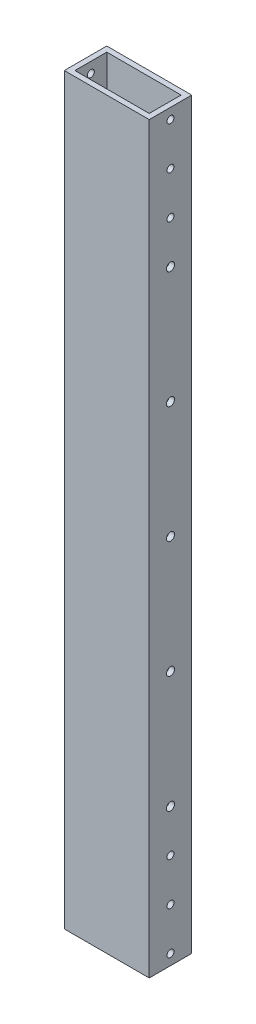
ISO-10303-21;
HEADER;
FILE_DESCRIPTION(('STEP AP214'),'2;1');
FILE_NAME('part.step','',(''),(''),'','','');
FILE_SCHEMA(('AUTOMOTIVE_DESIGN { 1 0 10303 214 1 1 1 1 }'));
ENDSEC;
DATA;
#1=APPLICATION_CONTEXT('core data for automotive mechanical design processes');
#2=APPLICATION_PROTOCOL_DEFINITION('international standard','automotive_design',2000,#1);
#3=PRODUCT_CONTEXT('',#1,'mechanical');
#4=PRODUCT('Part','Part','',(#3));
#5=PRODUCT_RELATED_PRODUCT_CATEGORY('part','',(#4));
#6=PRODUCT_DEFINITION_FORMATION('','',#4);
#7=PRODUCT_DEFINITION_CONTEXT('part definition',#1,'design');
#8=PRODUCT_DEFINITION('design','',#6,#7);
#9=PRODUCT_DEFINITION_SHAPE('','',#8);
#10=(LENGTH_UNIT() NAMED_UNIT(*) SI_UNIT(.MILLI.,.METRE.));
#11=(NAMED_UNIT(*) PLANE_ANGLE_UNIT() SI_UNIT($,.RADIAN.));
#12=(NAMED_UNIT(*) SI_UNIT($,.STERADIAN.) SOLID_ANGLE_UNIT());
#13=UNCERTAINTY_MEASURE_WITH_UNIT(LENGTH_MEASURE(1.E-05),#10,'distance_accuracy_value','');
#14=(GEOMETRIC_REPRESENTATION_CONTEXT(3) GLOBAL_UNCERTAINTY_ASSIGNED_CONTEXT((#13)) GLOBAL_UNIT_ASSIGNED_CONTEXT((#10,
#11,#12)) REPRESENTATION_CONTEXT('',''));
#15=CARTESIAN_POINT('',(0.,0.,0.));
#16=DIRECTION('',(0.,0.,1.));
#17=DIRECTION('',(1.,0.,0.));
#18=AXIS2_PLACEMENT_3D('',#15,#16,#17);
#19=CARTESIAN_POINT('',(0.,444.5,0.));
#20=DIRECTION('',(0.,-1.,0.));
#21=DIRECTION('',(0.,0.,-1.));
#22=AXIS2_PLACEMENT_3D('',#19,#20,#21);
#23=PLANE('',#22);
#24=DIRECTION('',(0.,0.,1.));
#25=VECTOR('',#24,1.);
#26=CARTESIAN_POINT('',(0.,444.5,0.));
#27=LINE('',#26,#25);
#28=CARTESIAN_POINT('',(0.,444.5,-25.4));
#29=VERTEX_POINT('',#28);
#30=CARTESIAN_POINT('',(0.,444.5,0.));
#31=VERTEX_POINT('',#30);
#32=EDGE_CURVE('E151',#29,#31,#27,.T.);
#33=ORIENTED_EDGE('',*,*,#32,.T.);
#34=DIRECTION('',(1.,0.,0.));
#35=VECTOR('',#34,1.);
#36=CARTESIAN_POINT('',(0.,444.5,0.));
#37=LINE('',#36,#35);
#38=CARTESIAN_POINT('',(50.8,444.5,0.));
#39=VERTEX_POINT('',#38);
#40=EDGE_CURVE('E154',#31,#39,#37,.T.);
#41=ORIENTED_EDGE('',*,*,#40,.T.);
#42=DIRECTION('',(0.,0.,-1.));
#43=VECTOR('',#42,1.);
#44=CARTESIAN_POINT('',(50.8,444.5,0.));
#45=LINE('',#44,#43);
#46=CARTESIAN_POINT('',(50.8,444.5,-25.4));
#47=VERTEX_POINT('',#46);
#48=EDGE_CURVE('E157',#39,#47,#45,.T.);
#49=ORIENTED_EDGE('',*,*,#48,.T.);
#50=DIRECTION('',(-1.,0.,0.));
#51=VECTOR('',#50,1.);
#52=CARTESIAN_POINT('',(0.,444.5,-25.4));
#53=LINE('',#52,#51);
#54=EDGE_CURVE('E159',#47,#29,#53,.T.);
#55=ORIENTED_EDGE('',*,*,#54,.T.);
#56=EDGE_LOOP('',(#33,#41,#49,#55));
#57=FACE_BOUND('',#56,.T.);
#58=DIRECTION('',(1.,0.,0.));
#59=VECTOR('',#58,1.);
#60=CARTESIAN_POINT('',(3.175,444.5,-3.175));
#61=LINE('',#60,#59);
#62=CARTESIAN_POINT('',(3.175,444.5,-3.175));
#63=VERTEX_POINT('',#62);
#64=CARTESIAN_POINT('',(47.625,444.5,-3.175));
#65=VERTEX_POINT('',#64);
#66=EDGE_CURVE('E113',#63,#65,#61,.T.);
#67=ORIENTED_EDGE('',*,*,#66,.F.);
#68=DIRECTION('',(0.,0.,1.));
#69=VECTOR('',#68,1.);
#70=CARTESIAN_POINT('',(3.175,444.5,-3.175));
#71=LINE('',#70,#69);
#72=CARTESIAN_POINT('',(3.175,444.5,-22.225));
#73=VERTEX_POINT('',#72);
#74=EDGE_CURVE('E135',#73,#63,#71,.T.);
#75=ORIENTED_EDGE('',*,*,#74,.F.);
#76=DIRECTION('',(-1.,0.,0.));
#77=VECTOR('',#76,1.);
#78=CARTESIAN_POINT('',(3.175,444.5,-22.225));
#79=LINE('',#78,#77);
#80=CARTESIAN_POINT('',(47.625,444.5,-22.225));
#81=VERTEX_POINT('',#80);
#82=EDGE_CURVE('E133',#81,#73,#79,.T.);
#83=ORIENTED_EDGE('',*,*,#82,.F.);
#84=DIRECTION('',(0.,0.,-1.));
#85=VECTOR('',#84,1.);
#86=CARTESIAN_POINT('',(47.625,444.5,-3.175));
#87=LINE('',#86,#85);
#88=EDGE_CURVE('E121',#65,#81,#87,.T.);
#89=ORIENTED_EDGE('',*,*,#88,.F.);
#90=EDGE_LOOP('',(#67,#75,#83,#89));
#91=FACE_BOUND('',#90,.T.);
#92=ADVANCED_FACE('F46',(#57,#91),#23,.F.);
#93=CARTESIAN_POINT('',(0.,0.,0.));
#94=DIRECTION('',(0.,-1.,0.));
#95=DIRECTION('',(0.,0.,-1.));
#96=AXIS2_PLACEMENT_3D('',#93,#94,#95);
#97=PLANE('',#96);
#98=DIRECTION('',(0.,0.,1.));
#99=VECTOR('',#98,1.);
#100=CARTESIAN_POINT('',(0.,0.,0.));
#101=LINE('',#100,#99);
#102=CARTESIAN_POINT('',(0.,0.,-25.4));
#103=VERTEX_POINT('',#102);
#104=CARTESIAN_POINT('',(0.,0.,0.));
#105=VERTEX_POINT('',#104);
#106=EDGE_CURVE('E129',#103,#105,#101,.T.);
#107=ORIENTED_EDGE('',*,*,#106,.F.);
#108=DIRECTION('',(-1.,0.,0.));
#109=VECTOR('',#108,1.);
#110=CARTESIAN_POINT('',(0.,0.,-25.4));
#111=LINE('',#110,#109);
#112=CARTESIAN_POINT('',(50.8,0.,-25.4));
#113=VERTEX_POINT('',#112);
#114=EDGE_CURVE('E155',#113,#103,#111,.T.);
#115=ORIENTED_EDGE('',*,*,#114,.F.);
#116=DIRECTION('',(0.,0.,-1.));
#117=VECTOR('',#116,1.);
#118=CARTESIAN_POINT('',(50.8,0.,0.));
#119=LINE('',#118,#117);
#120=CARTESIAN_POINT('',(50.8,0.,0.));
#121=VERTEX_POINT('',#120);
#122=EDGE_CURVE('E166',#121,#113,#119,.T.);
#123=ORIENTED_EDGE('',*,*,#122,.F.);
#124=DIRECTION('',(1.,0.,0.));
#125=VECTOR('',#124,1.);
#126=CARTESIAN_POINT('',(0.,0.,0.));
#127=LINE('',#126,#125);
#128=EDGE_CURVE('E164',#105,#121,#127,.T.);
#129=ORIENTED_EDGE('',*,*,#128,.F.);
#130=EDGE_LOOP('',(#107,#115,#123,#129));
#131=FACE_BOUND('',#130,.T.);
#132=DIRECTION('',(0.,0.,1.));
#133=VECTOR('',#132,1.);
#134=CARTESIAN_POINT('',(3.175,0.,-3.175));
#135=LINE('',#134,#133);
#136=CARTESIAN_POINT('',(3.175,0.,-22.225));
#137=VERTEX_POINT('',#136);
#138=CARTESIAN_POINT('',(3.175,0.,-3.175));
#139=VERTEX_POINT('',#138);
#140=EDGE_CURVE('E122',#137,#139,#135,.T.);
#141=ORIENTED_EDGE('',*,*,#140,.T.);
#142=DIRECTION('',(1.,0.,0.));
#143=VECTOR('',#142,1.);
#144=CARTESIAN_POINT('',(3.175,0.,-3.175));
#145=LINE('',#144,#143);
#146=CARTESIAN_POINT('',(47.625,0.,-3.175));
#147=VERTEX_POINT('',#146);
#148=EDGE_CURVE('E71',#139,#147,#145,.T.);
#149=ORIENTED_EDGE('',*,*,#148,.T.);
#150=DIRECTION('',(0.,0.,-1.));
#151=VECTOR('',#150,1.);
#152=CARTESIAN_POINT('',(47.625,0.,-3.175));
#153=LINE('',#152,#151);
#154=CARTESIAN_POINT('',(47.625,0.,-22.225));
#155=VERTEX_POINT('',#154);
#156=EDGE_CURVE('E128',#147,#155,#153,.T.);
#157=ORIENTED_EDGE('',*,*,#156,.T.);
#158=DIRECTION('',(-1.,0.,0.));
#159=VECTOR('',#158,1.);
#160=CARTESIAN_POINT('',(3.175,0.,-22.225));
#161=LINE('',#160,#159);
#162=EDGE_CURVE('E143',#155,#137,#161,.T.);
#163=ORIENTED_EDGE('',*,*,#162,.T.);
#164=EDGE_LOOP('',(#141,#149,#157,#163));
#165=FACE_BOUND('',#164,.T.);
#166=ADVANCED_FACE('F230',(#131,#165),#97,.T.);
#167=CARTESIAN_POINT('',(0.,444.5,0.));
#168=DIRECTION('',(1.,0.,0.));
#169=DIRECTION('',(0.,0.,-1.));
#170=AXIS2_PLACEMENT_3D('',#167,#168,#169);
#171=PLANE('',#170);
#172=CARTESIAN_POINT('',(0.,438.150000000008,-12.7000000000873));
#173=DIRECTION('',(1.,0.,0.));
#174=DIRECTION('',(0.,0.,-1.));
#175=AXIS2_PLACEMENT_3D('',#172,#173,#174);
#176=CIRCLE('',#175,2.08279999999999);
#177=CARTESIAN_POINT('',(0.,438.150000000008,-14.7828000000873));
#178=VERTEX_POINT('',#177);
#179=EDGE_CURVE('E180',#178,#178,#176,.F.);
#180=ORIENTED_EDGE('',*,*,#179,.F.);
#181=EDGE_LOOP('',(#180));
#182=FACE_BOUND('',#181,.T.);
#183=CARTESIAN_POINT('',(0.,412.750000000008,-12.7000000000873));
#184=DIRECTION('',(1.,0.,0.));
#185=DIRECTION('',(0.,0.,-1.));
#186=AXIS2_PLACEMENT_3D('',#183,#184,#185);
#187=CIRCLE('',#186,2.0828);
#188=CARTESIAN_POINT('',(0.,412.750000000008,-14.7828000000873));
#189=VERTEX_POINT('',#188);
#190=EDGE_CURVE('E283',#189,#189,#187,.F.);
#191=ORIENTED_EDGE('',*,*,#190,.F.);
#192=EDGE_LOOP('',(#191));
#193=FACE_BOUND('',#192,.T.);
#194=CARTESIAN_POINT('',(0.,387.350000000008,-12.7000000000873));
#195=DIRECTION('',(1.,0.,0.));
#196=DIRECTION('',(0.,0.,-1.));
#197=AXIS2_PLACEMENT_3D('',#194,#195,#196);
#198=CIRCLE('',#197,2.08279999999982);
#199=CARTESIAN_POINT('',(0.,387.350000000008,-14.7828000000871));
#200=VERTEX_POINT('',#199);
#201=EDGE_CURVE('E287',#200,#200,#198,.F.);
#202=ORIENTED_EDGE('',*,*,#201,.F.);
#203=EDGE_LOOP('',(#202));
#204=FACE_BOUND('',#203,.T.);
#205=CARTESIAN_POINT('',(0.,57.1499999999919,-12.7000000000873));
#206=DIRECTION('',(1.,0.,0.));
#207=DIRECTION('',(0.,0.,-1.));
#208=AXIS2_PLACEMENT_3D('',#205,#206,#207);
#209=CIRCLE('',#208,2.08279999999982);
#210=CARTESIAN_POINT('',(0.,57.1499999999919,-14.7828000000871));
#211=VERTEX_POINT('',#210);
#212=EDGE_CURVE('E291',#211,#211,#209,.F.);
#213=ORIENTED_EDGE('',*,*,#212,.F.);
#214=EDGE_LOOP('',(#213));
#215=FACE_BOUND('',#214,.T.);
#216=CARTESIAN_POINT('',(0.,31.7499999999921,-12.7000000000873));
#217=DIRECTION('',(1.,0.,0.));
#218=DIRECTION('',(0.,0.,-1.));
#219=AXIS2_PLACEMENT_3D('',#216,#217,#218);
#220=CIRCLE('',#219,2.0828);
#221=CARTESIAN_POINT('',(0.,31.7499999999921,-14.7828000000873));
#222=VERTEX_POINT('',#221);
#223=EDGE_CURVE('E295',#222,#222,#220,.F.);
#224=ORIENTED_EDGE('',*,*,#223,.F.);
#225=EDGE_LOOP('',(#224));
#226=FACE_BOUND('',#225,.T.);
#227=CARTESIAN_POINT('',(0.,6.34999999999197,-12.7000000000873));
#228=DIRECTION('',(1.,0.,0.));
#229=DIRECTION('',(0.,0.,-1.));
#230=AXIS2_PLACEMENT_3D('',#227,#228,#229);
#231=CIRCLE('',#230,2.08279999999999);
#232=CARTESIAN_POINT('',(0.,6.34999999999197,-14.7828000000873));
#233=VERTEX_POINT('',#232);
#234=EDGE_CURVE('E298',#233,#233,#231,.F.);
#235=ORIENTED_EDGE('',*,*,#234,.F.);
#236=EDGE_LOOP('',(#235));
#237=FACE_BOUND('',#236,.T.);
#238=ORIENTED_EDGE('',*,*,#106,.T.);
#239=DIRECTION('',(0.,-1.,0.));
#240=VECTOR('',#239,1.);
#241=CARTESIAN_POINT('',(0.,444.5,0.));
#242=LINE('',#241,#240);
#243=EDGE_CURVE('E11',#31,#105,#242,.T.);
#244=ORIENTED_EDGE('',*,*,#243,.F.);
#245=ORIENTED_EDGE('',*,*,#32,.F.);
#246=DIRECTION('',(0.,-1.,0.));
#247=VECTOR('',#246,1.);
#248=CARTESIAN_POINT('',(0.,444.5,-25.4));
#249=LINE('',#248,#247);
#250=EDGE_CURVE('E161',#29,#103,#249,.T.);
#251=ORIENTED_EDGE('',*,*,#250,.T.);
#252=EDGE_LOOP('',(#238,#244,#245,#251));
#253=FACE_BOUND('',#252,.T.);
#254=ADVANCED_FACE('F48',(#182,#193,#204,#215,#226,#237,#253),#171,.F.);
#255=CARTESIAN_POINT('',(0.,444.5,0.));
#256=DIRECTION('',(0.,0.,-1.));
#257=DIRECTION('',(-1.,0.,0.));
#258=AXIS2_PLACEMENT_3D('',#255,#256,#257);
#259=PLANE('',#258);
#260=ORIENTED_EDGE('',*,*,#128,.T.);
#261=DIRECTION('',(0.,-1.,0.));
#262=VECTOR('',#261,1.);
#263=CARTESIAN_POINT('',(50.8,444.5,0.));
#264=LINE('',#263,#262);
#265=EDGE_CURVE('E55',#39,#121,#264,.T.);
#266=ORIENTED_EDGE('',*,*,#265,.F.);
#267=ORIENTED_EDGE('',*,*,#40,.F.);
#268=ORIENTED_EDGE('',*,*,#243,.T.);
#269=EDGE_LOOP('',(#260,#266,#267,#268));
#270=FACE_BOUND('',#269,.T.);
#271=ADVANCED_FACE('F255',(#270),#259,.F.);
#272=CARTESIAN_POINT('',(50.8,444.5,0.));
#273=DIRECTION('',(-1.,0.,0.));
#274=DIRECTION('',(0.,0.,1.));
#275=AXIS2_PLACEMENT_3D('',#272,#273,#274);
#276=PLANE('',#275);
#277=CARTESIAN_POINT('',(50.8,361.95,-12.6999999999997));
#278=DIRECTION('',(1.,0.,0.));
#279=DIRECTION('',(0.,0.,-1.));
#280=AXIS2_PLACEMENT_3D('',#277,#278,#279);
#281=CIRCLE('',#280,2.42570000004056);
#282=CARTESIAN_POINT('',(50.8,361.95,-15.1257000000403));
#283=VERTEX_POINT('',#282);
#284=EDGE_CURVE('E306',#283,#283,#281,.T.);
#285=ORIENTED_EDGE('',*,*,#284,.F.);
#286=EDGE_LOOP('',(#285));
#287=FACE_BOUND('',#286,.T.);
#288=CARTESIAN_POINT('',(50.8,292.1,-12.7));
#289=DIRECTION('',(1.,0.,0.));
#290=DIRECTION('',(0.,0.,-1.));
#291=AXIS2_PLACEMENT_3D('',#288,#289,#290);
#292=CIRCLE('',#291,2.42570000004056);
#293=CARTESIAN_POINT('',(50.8,292.1,-15.1257000000405));
#294=VERTEX_POINT('',#293);
#295=EDGE_CURVE('E445',#294,#294,#292,.T.);
#296=ORIENTED_EDGE('',*,*,#295,.F.);
#297=EDGE_LOOP('',(#296));
#298=FACE_BOUND('',#297,.T.);
#299=CARTESIAN_POINT('',(50.8,222.25,-12.7000000000002));
#300=DIRECTION('',(1.,0.,0.));
#301=DIRECTION('',(0.,0.,-1.));
#302=AXIS2_PLACEMENT_3D('',#299,#300,#301);
#303=CIRCLE('',#302,2.42570000004056);
#304=CARTESIAN_POINT('',(50.8,222.25,-15.1257000000408));
#305=VERTEX_POINT('',#304);
#306=EDGE_CURVE('E441',#305,#305,#303,.T.);
#307=ORIENTED_EDGE('',*,*,#306,.F.);
#308=EDGE_LOOP('',(#307));
#309=FACE_BOUND('',#308,.T.);
#310=CARTESIAN_POINT('',(50.8,152.4,-12.7000000000005));
#311=DIRECTION('',(1.,0.,0.));
#312=DIRECTION('',(0.,0.,-1.));
#313=AXIS2_PLACEMENT_3D('',#310,#311,#312);
#314=CIRCLE('',#313,2.42570000004056);
#315=CARTESIAN_POINT('',(50.8,152.4,-15.125700000041));
#316=VERTEX_POINT('',#315);
#317=EDGE_CURVE('E437',#316,#316,#314,.T.);
#318=ORIENTED_EDGE('',*,*,#317,.F.);
#319=EDGE_LOOP('',(#318));
#320=FACE_BOUND('',#319,.T.);
#321=CARTESIAN_POINT('',(50.8,82.55,-12.7000000000007));
#322=DIRECTION('',(1.,0.,0.));
#323=DIRECTION('',(0.,0.,-1.));
#324=AXIS2_PLACEMENT_3D('',#321,#322,#323);
#325=CIRCLE('',#324,2.42570000004056);
#326=CARTESIAN_POINT('',(50.8,82.55,-15.1257000000413));
#327=VERTEX_POINT('',#326);
#328=EDGE_CURVE('E433',#327,#327,#325,.T.);
#329=ORIENTED_EDGE('',*,*,#328,.F.);
#330=EDGE_LOOP('',(#329));
#331=FACE_BOUND('',#330,.T.);
#332=CARTESIAN_POINT('',(50.8,438.150000000008,-12.7000000000873));
#333=DIRECTION('',(1.,0.,0.));
#334=DIRECTION('',(0.,0.,-1.));
#335=AXIS2_PLACEMENT_3D('',#332,#333,#334);
#336=CIRCLE('',#335,2.08279999999999);
#337=CARTESIAN_POINT('',(50.8,438.150000000008,-14.7828000000873));
#338=VERTEX_POINT('',#337);
#339=EDGE_CURVE('E428',#338,#338,#336,.T.);
#340=ORIENTED_EDGE('',*,*,#339,.F.);
#341=EDGE_LOOP('',(#340));
#342=FACE_BOUND('',#341,.T.);
#343=CARTESIAN_POINT('',(50.8,412.750000000008,-12.7000000000873));
#344=DIRECTION('',(1.,0.,0.));
#345=DIRECTION('',(0.,0.,-1.));
#346=AXIS2_PLACEMENT_3D('',#343,#344,#345);
#347=CIRCLE('',#346,2.0828);
#348=CARTESIAN_POINT('',(50.8,412.750000000008,-14.7828000000873));
#349=VERTEX_POINT('',#348);
#350=EDGE_CURVE('E425',#349,#349,#347,.T.);
#351=ORIENTED_EDGE('',*,*,#350,.F.);
#352=EDGE_LOOP('',(#351));
#353=FACE_BOUND('',#352,.T.);
#354=CARTESIAN_POINT('',(50.8,387.350000000008,-12.7000000000873));
#355=DIRECTION('',(1.,0.,0.));
#356=DIRECTION('',(0.,0.,-1.));
#357=AXIS2_PLACEMENT_3D('',#354,#355,#356);
#358=CIRCLE('',#357,2.08279999999982);
#359=CARTESIAN_POINT('',(50.8,387.350000000008,-14.7828000000871));
#360=VERTEX_POINT('',#359);
#361=EDGE_CURVE('E416',#360,#360,#358,.T.);
#362=ORIENTED_EDGE('',*,*,#361,.F.);
#363=EDGE_LOOP('',(#362));
#364=FACE_BOUND('',#363,.T.);
#365=CARTESIAN_POINT('',(50.8,57.1499999999919,-12.7000000000873));
#366=DIRECTION('',(1.,0.,0.));
#367=DIRECTION('',(0.,0.,1.));
#368=AXIS2_PLACEMENT_3D('',#365,#366,#367);
#369=CIRCLE('',#368,2.08279999999982);
#370=CARTESIAN_POINT('',(50.8,57.1499999999919,-10.6172000000874));
#371=VERTEX_POINT('',#370);
#372=EDGE_CURVE('E413',#371,#371,#369,.T.);
#373=ORIENTED_EDGE('',*,*,#372,.F.);
#374=EDGE_LOOP('',(#373));
#375=FACE_BOUND('',#374,.T.);
#376=CARTESIAN_POINT('',(50.8,31.7499999999921,-12.7000000000873));
#377=DIRECTION('',(1.,0.,0.));
#378=DIRECTION('',(0.,0.,1.));
#379=AXIS2_PLACEMENT_3D('',#376,#377,#378);
#380=CIRCLE('',#379,2.0828);
#381=CARTESIAN_POINT('',(50.8,31.7499999999921,-10.6172000000873));
#382=VERTEX_POINT('',#381);
#383=EDGE_CURVE('E309',#382,#382,#380,.T.);
#384=ORIENTED_EDGE('',*,*,#383,.F.);
#385=EDGE_LOOP('',(#384));
#386=FACE_BOUND('',#385,.T.);
#387=CARTESIAN_POINT('',(50.8,6.34999999999197,-12.7000000000873));
#388=DIRECTION('',(1.,0.,0.));
#389=DIRECTION('',(0.,0.,1.));
#390=AXIS2_PLACEMENT_3D('',#387,#388,#389);
#391=CIRCLE('',#390,2.08279999999999);
#392=CARTESIAN_POINT('',(50.8,6.34999999999197,-10.6172000000873));
#393=VERTEX_POINT('',#392);
#394=EDGE_CURVE('E300',#393,#393,#391,.T.);
#395=ORIENTED_EDGE('',*,*,#394,.F.);
#396=EDGE_LOOP('',(#395));
#397=FACE_BOUND('',#396,.T.);
#398=ORIENTED_EDGE('',*,*,#122,.T.);
#399=DIRECTION('',(0.,-1.,0.));
#400=VECTOR('',#399,1.);
#401=CARTESIAN_POINT('',(50.8,444.5,-25.4));
#402=LINE('',#401,#400);
#403=EDGE_CURVE('E171',#47,#113,#402,.T.);
#404=ORIENTED_EDGE('',*,*,#403,.F.);
#405=ORIENTED_EDGE('',*,*,#48,.F.);
#406=ORIENTED_EDGE('',*,*,#265,.T.);
#407=EDGE_LOOP('',(#398,#404,#405,#406));
#408=FACE_BOUND('',#407,.T.);
#409=ADVANCED_FACE('F252',(#287,#298,#309,#320,#331,#342,#353,#364,#375,#386,#397,#408),#276,.F.);
#410=CARTESIAN_POINT('',(0.,444.5,-25.4));
#411=DIRECTION('',(0.,0.,1.));
#412=DIRECTION('',(1.,0.,0.));
#413=AXIS2_PLACEMENT_3D('',#410,#411,#412);
#414=PLANE('',#413);
#415=ORIENTED_EDGE('',*,*,#114,.T.);
#416=ORIENTED_EDGE('',*,*,#250,.F.);
#417=ORIENTED_EDGE('',*,*,#54,.F.);
#418=ORIENTED_EDGE('',*,*,#403,.T.);
#419=EDGE_LOOP('',(#415,#416,#417,#418));
#420=FACE_BOUND('',#419,.T.);
#421=ADVANCED_FACE('F249',(#420),#414,.F.);
#422=CARTESIAN_POINT('',(3.175,444.5,-3.175));
#423=DIRECTION('',(0.,0.,-1.));
#424=DIRECTION('',(-1.,0.,0.));
#425=AXIS2_PLACEMENT_3D('',#422,#423,#424);
#426=PLANE('',#425);
#427=ORIENTED_EDGE('',*,*,#148,.F.);
#428=DIRECTION('',(0.,-1.,0.));
#429=VECTOR('',#428,1.);
#430=CARTESIAN_POINT('',(3.175,444.5,-3.175));
#431=LINE('',#430,#429);
#432=EDGE_CURVE('E117',#63,#139,#431,.T.);
#433=ORIENTED_EDGE('',*,*,#432,.F.);
#434=ORIENTED_EDGE('',*,*,#66,.T.);
#435=DIRECTION('',(0.,-1.,0.));
#436=VECTOR('',#435,1.);
#437=CARTESIAN_POINT('',(47.625,444.5,-3.175));
#438=LINE('',#437,#436);
#439=EDGE_CURVE('E116',#65,#147,#438,.T.);
#440=ORIENTED_EDGE('',*,*,#439,.T.);
#441=EDGE_LOOP('',(#427,#433,#434,#440));
#442=FACE_BOUND('',#441,.T.);
#443=ADVANCED_FACE('F115',(#442),#426,.T.);
#444=CARTESIAN_POINT('',(47.625,444.5,-3.175));
#445=DIRECTION('',(-1.,0.,0.));
#446=DIRECTION('',(0.,0.,1.));
#447=AXIS2_PLACEMENT_3D('',#444,#445,#446);
#448=PLANE('',#447);
#449=CARTESIAN_POINT('',(47.625,361.95,-12.6999999999997));
#450=DIRECTION('',(-1.,0.,0.));
#451=DIRECTION('',(0.,0.,1.));
#452=AXIS2_PLACEMENT_3D('',#449,#450,#451);
#453=CIRCLE('',#452,2.42570000004056);
#454=CARTESIAN_POINT('',(47.625,361.95,-10.2742999999592));
#455=VERTEX_POINT('',#454);
#456=EDGE_CURVE('E301',#455,#455,#453,.F.);
#457=ORIENTED_EDGE('',*,*,#456,.T.);
#458=EDGE_LOOP('',(#457));
#459=FACE_BOUND('',#458,.T.);
#460=CARTESIAN_POINT('',(47.625,292.1,-12.7));
#461=DIRECTION('',(-1.,0.,0.));
#462=DIRECTION('',(0.,0.,1.));
#463=AXIS2_PLACEMENT_3D('',#460,#461,#462);
#464=CIRCLE('',#463,2.42570000004056);
#465=CARTESIAN_POINT('',(47.625,292.1,-10.2742999999594));
#466=VERTEX_POINT('',#465);
#467=EDGE_CURVE('E389',#466,#466,#464,.F.);
#468=ORIENTED_EDGE('',*,*,#467,.T.);
#469=EDGE_LOOP('',(#468));
#470=FACE_BOUND('',#469,.T.);
#471=CARTESIAN_POINT('',(47.625,222.25,-12.7000000000002));
#472=DIRECTION('',(-1.,0.,0.));
#473=DIRECTION('',(0.,0.,1.));
#474=AXIS2_PLACEMENT_3D('',#471,#472,#473);
#475=CIRCLE('',#474,2.42570000004056);
#476=CARTESIAN_POINT('',(47.625,222.25,-10.2742999999597));
#477=VERTEX_POINT('',#476);
#478=EDGE_CURVE('E393',#477,#477,#475,.F.);
#479=ORIENTED_EDGE('',*,*,#478,.T.);
#480=EDGE_LOOP('',(#479));
#481=FACE_BOUND('',#480,.T.);
#482=CARTESIAN_POINT('',(47.625,152.4,-12.7000000000005));
#483=DIRECTION('',(-1.,0.,0.));
#484=DIRECTION('',(0.,0.,1.));
#485=AXIS2_PLACEMENT_3D('',#482,#483,#484);
#486=CIRCLE('',#485,2.42570000004056);
#487=CARTESIAN_POINT('',(47.625,152.4,-10.2742999999599));
#488=VERTEX_POINT('',#487);
#489=EDGE_CURVE('E397',#488,#488,#486,.F.);
#490=ORIENTED_EDGE('',*,*,#489,.T.);
#491=EDGE_LOOP('',(#490));
#492=FACE_BOUND('',#491,.T.);
#493=CARTESIAN_POINT('',(47.625,82.55,-12.7000000000007));
#494=DIRECTION('',(-1.,0.,0.));
#495=DIRECTION('',(0.,0.,1.));
#496=AXIS2_PLACEMENT_3D('',#493,#494,#495);
#497=CIRCLE('',#496,2.42570000004056);
#498=CARTESIAN_POINT('',(47.625,82.55,-10.2742999999601));
#499=VERTEX_POINT('',#498);
#500=EDGE_CURVE('E401',#499,#499,#497,.F.);
#501=ORIENTED_EDGE('',*,*,#500,.T.);
#502=EDGE_LOOP('',(#501));
#503=FACE_BOUND('',#502,.T.);
#504=CARTESIAN_POINT('',(47.625,438.150000000008,-12.7000000000873));
#505=DIRECTION('',(-1.,0.,0.));
#506=DIRECTION('',(0.,0.,1.));
#507=AXIS2_PLACEMENT_3D('',#504,#505,#506);
#508=CIRCLE('',#507,2.08279999999999);
#509=CARTESIAN_POINT('',(47.625,438.150000000008,-10.6172000000873));
#510=VERTEX_POINT('',#509);
#511=EDGE_CURVE('E141',#510,#510,#508,.T.);
#512=ORIENTED_EDGE('',*,*,#511,.F.);
#513=EDGE_LOOP('',(#512));
#514=FACE_BOUND('',#513,.T.);
#515=CARTESIAN_POINT('',(47.625,412.750000000008,-12.7000000000873));
#516=DIRECTION('',(-1.,0.,0.));
#517=DIRECTION('',(0.,0.,1.));
#518=AXIS2_PLACEMENT_3D('',#515,#516,#517);
#519=CIRCLE('',#518,2.0828);
#520=CARTESIAN_POINT('',(47.625,412.750000000008,-10.6172000000873));
#521=VERTEX_POINT('',#520);
#522=EDGE_CURVE('E194',#521,#521,#519,.T.);
#523=ORIENTED_EDGE('',*,*,#522,.F.);
#524=EDGE_LOOP('',(#523));
#525=FACE_BOUND('',#524,.T.);
#526=CARTESIAN_POINT('',(47.625,387.350000000008,-12.7000000000873));
#527=DIRECTION('',(-1.,0.,0.));
#528=DIRECTION('',(0.,0.,1.));
#529=AXIS2_PLACEMENT_3D('',#526,#527,#528);
#530=CIRCLE('',#529,2.08279999999982);
#531=CARTESIAN_POINT('',(47.625,387.350000000008,-10.6172000000874));
#532=VERTEX_POINT('',#531);
#533=EDGE_CURVE('E191',#532,#532,#530,.T.);
#534=ORIENTED_EDGE('',*,*,#533,.F.);
#535=EDGE_LOOP('',(#534));
#536=FACE_BOUND('',#535,.T.);
#537=CARTESIAN_POINT('',(47.625,57.1499999999919,-12.7000000000873));
#538=DIRECTION('',(-1.,0.,0.));
#539=DIRECTION('',(0.,0.,1.));
#540=AXIS2_PLACEMENT_3D('',#537,#538,#539);
#541=CIRCLE('',#540,2.08279999999982);
#542=CARTESIAN_POINT('',(47.625,57.1499999999919,-10.6172000000874));
#543=VERTEX_POINT('',#542);
#544=EDGE_CURVE('E188',#543,#543,#541,.T.);
#545=ORIENTED_EDGE('',*,*,#544,.F.);
#546=EDGE_LOOP('',(#545));
#547=FACE_BOUND('',#546,.T.);
#548=CARTESIAN_POINT('',(47.625,31.7499999999921,-12.7000000000873));
#549=DIRECTION('',(-1.,0.,0.));
#550=DIRECTION('',(0.,0.,1.));
#551=AXIS2_PLACEMENT_3D('',#548,#549,#550);
#552=CIRCLE('',#551,2.0828);
#553=CARTESIAN_POINT('',(47.625,31.7499999999921,-10.6172000000873));
#554=VERTEX_POINT('',#553);
#555=EDGE_CURVE('E184',#554,#554,#552,.T.);
#556=ORIENTED_EDGE('',*,*,#555,.F.);
#557=EDGE_LOOP('',(#556));
#558=FACE_BOUND('',#557,.T.);
#559=CARTESIAN_POINT('',(47.625,6.34999999999197,-12.7000000000873));
#560=DIRECTION('',(-1.,0.,0.));
#561=DIRECTION('',(0.,0.,1.));
#562=AXIS2_PLACEMENT_3D('',#559,#560,#561);
#563=CIRCLE('',#562,2.08279999999999);
#564=CARTESIAN_POINT('',(47.625,6.34999999999197,-10.6172000000873));
#565=VERTEX_POINT('',#564);
#566=EDGE_CURVE('E179',#565,#565,#563,.T.);
#567=ORIENTED_EDGE('',*,*,#566,.F.);
#568=EDGE_LOOP('',(#567));
#569=FACE_BOUND('',#568,.T.);
#570=ORIENTED_EDGE('',*,*,#156,.F.);
#571=ORIENTED_EDGE('',*,*,#439,.F.);
#572=ORIENTED_EDGE('',*,*,#88,.T.);
#573=DIRECTION('',(0.,-1.,0.));
#574=VECTOR('',#573,1.);
#575=CARTESIAN_POINT('',(47.625,444.5,-22.225));
#576=LINE('',#575,#574);
#577=EDGE_CURVE('E130',#81,#155,#576,.T.);
#578=ORIENTED_EDGE('',*,*,#577,.T.);
#579=EDGE_LOOP('',(#570,#571,#572,#578));
#580=FACE_BOUND('',#579,.T.);
#581=ADVANCED_FACE('F125',(#459,#470,#481,#492,#503,#514,#525,#536,#547,#558,#569,#580),#448,.T.);
#582=CARTESIAN_POINT('',(3.175,444.5,-22.225));
#583=DIRECTION('',(0.,0.,1.));
#584=DIRECTION('',(1.,0.,0.));
#585=AXIS2_PLACEMENT_3D('',#582,#583,#584);
#586=PLANE('',#585);
#587=ORIENTED_EDGE('',*,*,#162,.F.);
#588=ORIENTED_EDGE('',*,*,#577,.F.);
#589=ORIENTED_EDGE('',*,*,#82,.T.);
#590=DIRECTION('',(0.,-1.,0.));
#591=VECTOR('',#590,1.);
#592=CARTESIAN_POINT('',(3.175,444.5,-22.225));
#593=LINE('',#592,#591);
#594=EDGE_CURVE('E63',#73,#137,#593,.T.);
#595=ORIENTED_EDGE('',*,*,#594,.T.);
#596=EDGE_LOOP('',(#587,#588,#589,#595));
#597=FACE_BOUND('',#596,.T.);
#598=ADVANCED_FACE('F218',(#597),#586,.T.);
#599=CARTESIAN_POINT('',(3.175,444.5,-3.175));
#600=DIRECTION('',(1.,0.,0.));
#601=DIRECTION('',(0.,0.,-1.));
#602=AXIS2_PLACEMENT_3D('',#599,#600,#601);
#603=PLANE('',#602);
#604=CARTESIAN_POINT('',(3.175,438.150000000008,-12.7000000000873));
#605=DIRECTION('',(1.,0.,0.));
#606=DIRECTION('',(0.,0.,-1.));
#607=AXIS2_PLACEMENT_3D('',#604,#605,#606);
#608=CIRCLE('',#607,2.08279999999999);
#609=CARTESIAN_POINT('',(3.175,438.150000000008,-14.7828000000873));
#610=VERTEX_POINT('',#609);
#611=EDGE_CURVE('E50',#610,#610,#608,.T.);
#612=ORIENTED_EDGE('',*,*,#611,.F.);
#613=EDGE_LOOP('',(#612));
#614=FACE_BOUND('',#613,.T.);
#615=CARTESIAN_POINT('',(3.175,412.750000000008,-12.7000000000873));
#616=DIRECTION('',(1.,0.,0.));
#617=DIRECTION('',(0.,0.,-1.));
#618=AXIS2_PLACEMENT_3D('',#615,#616,#617);
#619=CIRCLE('',#618,2.0828);
#620=CARTESIAN_POINT('',(3.175,412.750000000008,-14.7828000000873));
#621=VERTEX_POINT('',#620);
#622=EDGE_CURVE('E192',#621,#621,#619,.T.);
#623=ORIENTED_EDGE('',*,*,#622,.F.);
#624=EDGE_LOOP('',(#623));
#625=FACE_BOUND('',#624,.T.);
#626=CARTESIAN_POINT('',(3.175,387.350000000008,-12.7000000000873));
#627=DIRECTION('',(1.,0.,0.));
#628=DIRECTION('',(0.,0.,-1.));
#629=AXIS2_PLACEMENT_3D('',#626,#627,#628);
#630=CIRCLE('',#629,2.08279999999982);
#631=CARTESIAN_POINT('',(3.175,387.350000000008,-14.7828000000871));
#632=VERTEX_POINT('',#631);
#633=EDGE_CURVE('E189',#632,#632,#630,.T.);
#634=ORIENTED_EDGE('',*,*,#633,.F.);
#635=EDGE_LOOP('',(#634));
#636=FACE_BOUND('',#635,.T.);
#637=CARTESIAN_POINT('',(3.175,57.1499999999919,-12.7000000000873));
#638=DIRECTION('',(1.,0.,0.));
#639=DIRECTION('',(0.,0.,-1.));
#640=AXIS2_PLACEMENT_3D('',#637,#638,#639);
#641=CIRCLE('',#640,2.08279999999982);
#642=CARTESIAN_POINT('',(3.175,57.1499999999919,-14.7828000000871));
#643=VERTEX_POINT('',#642);
#644=EDGE_CURVE('E185',#643,#643,#641,.T.);
#645=ORIENTED_EDGE('',*,*,#644,.F.);
#646=EDGE_LOOP('',(#645));
#647=FACE_BOUND('',#646,.T.);
#648=CARTESIAN_POINT('',(3.175,31.7499999999921,-12.7000000000873));
#649=DIRECTION('',(1.,0.,0.));
#650=DIRECTION('',(0.,0.,-1.));
#651=AXIS2_PLACEMENT_3D('',#648,#649,#650);
#652=CIRCLE('',#651,2.0828);
#653=CARTESIAN_POINT('',(3.175,31.7499999999921,-14.7828000000873));
#654=VERTEX_POINT('',#653);
#655=EDGE_CURVE('E181',#654,#654,#652,.T.);
#656=ORIENTED_EDGE('',*,*,#655,.F.);
#657=EDGE_LOOP('',(#656));
#658=FACE_BOUND('',#657,.T.);
#659=CARTESIAN_POINT('',(3.175,6.34999999999197,-12.7000000000873));
#660=DIRECTION('',(1.,0.,0.));
#661=DIRECTION('',(0.,0.,-1.));
#662=AXIS2_PLACEMENT_3D('',#659,#660,#661);
#663=CIRCLE('',#662,2.08279999999999);
#664=CARTESIAN_POINT('',(3.175,6.34999999999197,-14.7828000000873));
#665=VERTEX_POINT('',#664);
#666=EDGE_CURVE('E176',#665,#665,#663,.T.);
#667=ORIENTED_EDGE('',*,*,#666,.F.);
#668=EDGE_LOOP('',(#667));
#669=FACE_BOUND('',#668,.T.);
#670=ORIENTED_EDGE('',*,*,#140,.F.);
#671=ORIENTED_EDGE('',*,*,#594,.F.);
#672=ORIENTED_EDGE('',*,*,#74,.T.);
#673=ORIENTED_EDGE('',*,*,#432,.T.);
#674=EDGE_LOOP('',(#670,#671,#672,#673));
#675=FACE_BOUND('',#674,.T.);
#676=ADVANCED_FACE('F214',(#614,#625,#636,#647,#658,#669,#675),#603,.T.);
#677=CARTESIAN_POINT('',(-5.89104801542137,6.34999999999197,-12.7000000000873));
#678=DIRECTION('',(1.,0.,0.));
#679=DIRECTION('',(0.,0.,-1.));
#680=AXIS2_PLACEMENT_3D('',#677,#678,#679);
#681=CYLINDRICAL_SURFACE('',#680,2.08279999999999);
#682=ORIENTED_EDGE('',*,*,#666,.T.);
#683=EDGE_LOOP('',(#682));
#684=FACE_BOUND('',#683,.T.);
#685=ORIENTED_EDGE('',*,*,#234,.T.);
#686=EDGE_LOOP('',(#685));
#687=FACE_BOUND('',#686,.T.);
#688=ADVANCED_FACE('F217',(#684,#687),#681,.F.);
#689=CARTESIAN_POINT('',(-5.89104801542137,31.7499999999921,-12.7000000000873));
#690=DIRECTION('',(1.,0.,0.));
#691=DIRECTION('',(0.,0.,-1.));
#692=AXIS2_PLACEMENT_3D('',#689,#690,#691);
#693=CYLINDRICAL_SURFACE('',#692,2.0828);
#694=ORIENTED_EDGE('',*,*,#655,.T.);
#695=EDGE_LOOP('',(#694));
#696=FACE_BOUND('',#695,.T.);
#697=ORIENTED_EDGE('',*,*,#223,.T.);
#698=EDGE_LOOP('',(#697));
#699=FACE_BOUND('',#698,.T.);
#700=ADVANCED_FACE('F334',(#696,#699),#693,.F.);
#701=CARTESIAN_POINT('',(-5.89104801542137,57.1499999999919,-12.7000000000873));
#702=DIRECTION('',(1.,0.,0.));
#703=DIRECTION('',(0.,0.,-1.));
#704=AXIS2_PLACEMENT_3D('',#701,#702,#703);
#705=CYLINDRICAL_SURFACE('',#704,2.08279999999982);
#706=ORIENTED_EDGE('',*,*,#644,.T.);
#707=EDGE_LOOP('',(#706));
#708=FACE_BOUND('',#707,.T.);
#709=ORIENTED_EDGE('',*,*,#212,.T.);
#710=EDGE_LOOP('',(#709));
#711=FACE_BOUND('',#710,.T.);
#712=ADVANCED_FACE('F343',(#708,#711),#705,.F.);
#713=CARTESIAN_POINT('',(-5.89104801542137,387.350000000008,-12.7000000000873));
#714=DIRECTION('',(1.,0.,0.));
#715=DIRECTION('',(0.,0.,-1.));
#716=AXIS2_PLACEMENT_3D('',#713,#714,#715);
#717=CYLINDRICAL_SURFACE('',#716,2.08279999999982);
#718=ORIENTED_EDGE('',*,*,#633,.T.);
#719=EDGE_LOOP('',(#718));
#720=FACE_BOUND('',#719,.T.);
#721=ORIENTED_EDGE('',*,*,#201,.T.);
#722=EDGE_LOOP('',(#721));
#723=FACE_BOUND('',#722,.T.);
#724=ADVANCED_FACE('F348',(#720,#723),#717,.F.);
#725=CARTESIAN_POINT('',(-5.89104801542137,412.750000000008,-12.7000000000873));
#726=DIRECTION('',(1.,0.,0.));
#727=DIRECTION('',(0.,0.,-1.));
#728=AXIS2_PLACEMENT_3D('',#725,#726,#727);
#729=CYLINDRICAL_SURFACE('',#728,2.0828);
#730=ORIENTED_EDGE('',*,*,#622,.T.);
#731=EDGE_LOOP('',(#730));
#732=FACE_BOUND('',#731,.T.);
#733=ORIENTED_EDGE('',*,*,#190,.T.);
#734=EDGE_LOOP('',(#733));
#735=FACE_BOUND('',#734,.T.);
#736=ADVANCED_FACE('F335',(#732,#735),#729,.F.);
#737=CARTESIAN_POINT('',(-5.89104801542137,438.150000000008,-12.7000000000873));
#738=DIRECTION('',(1.,0.,0.));
#739=DIRECTION('',(0.,0.,-1.));
#740=AXIS2_PLACEMENT_3D('',#737,#738,#739);
#741=CYLINDRICAL_SURFACE('',#740,2.08279999999999);
#742=ORIENTED_EDGE('',*,*,#611,.T.);
#743=EDGE_LOOP('',(#742));
#744=FACE_BOUND('',#743,.T.);
#745=ORIENTED_EDGE('',*,*,#179,.T.);
#746=EDGE_LOOP('',(#745));
#747=FACE_BOUND('',#746,.T.);
#748=ADVANCED_FACE('F211',(#744,#747),#741,.F.);
#749=ORIENTED_EDGE('',*,*,#566,.T.);
#750=EDGE_LOOP('',(#749));
#751=FACE_BOUND('',#750,.T.);
#752=ORIENTED_EDGE('',*,*,#394,.T.);
#753=EDGE_LOOP('',(#752));
#754=FACE_BOUND('',#753,.T.);
#755=ADVANCED_FACE('F322',(#751,#754),#681,.F.);
#756=ORIENTED_EDGE('',*,*,#555,.T.);
#757=EDGE_LOOP('',(#756));
#758=FACE_BOUND('',#757,.T.);
#759=ORIENTED_EDGE('',*,*,#383,.T.);
#760=EDGE_LOOP('',(#759));
#761=FACE_BOUND('',#760,.T.);
#762=ADVANCED_FACE('F316',(#758,#761),#693,.F.);
#763=ORIENTED_EDGE('',*,*,#544,.T.);
#764=EDGE_LOOP('',(#763));
#765=FACE_BOUND('',#764,.T.);
#766=ORIENTED_EDGE('',*,*,#372,.T.);
#767=EDGE_LOOP('',(#766));
#768=FACE_BOUND('',#767,.T.);
#769=ADVANCED_FACE('F332',(#765,#768),#705,.F.);
#770=ORIENTED_EDGE('',*,*,#533,.T.);
#771=EDGE_LOOP('',(#770));
#772=FACE_BOUND('',#771,.T.);
#773=ORIENTED_EDGE('',*,*,#361,.T.);
#774=EDGE_LOOP('',(#773));
#775=FACE_BOUND('',#774,.T.);
#776=ADVANCED_FACE('F356',(#772,#775),#717,.F.);
#777=ORIENTED_EDGE('',*,*,#522,.T.);
#778=EDGE_LOOP('',(#777));
#779=FACE_BOUND('',#778,.T.);
#780=ORIENTED_EDGE('',*,*,#350,.T.);
#781=EDGE_LOOP('',(#780));
#782=FACE_BOUND('',#781,.T.);
#783=ADVANCED_FACE('F358',(#779,#782),#729,.F.);
#784=ORIENTED_EDGE('',*,*,#511,.T.);
#785=EDGE_LOOP('',(#784));
#786=FACE_BOUND('',#785,.T.);
#787=ORIENTED_EDGE('',*,*,#339,.T.);
#788=EDGE_LOOP('',(#787));
#789=FACE_BOUND('',#788,.T.);
#790=ADVANCED_FACE('F337',(#786,#789),#741,.F.);
#791=CARTESIAN_POINT('',(40.7640843233885,82.55,-12.7000000000007));
#792=DIRECTION('',(1.,0.,0.));
#793=DIRECTION('',(0.,0.,-1.));
#794=AXIS2_PLACEMENT_3D('',#791,#792,#793);
#795=CYLINDRICAL_SURFACE('',#794,2.42570000004056);
#796=ORIENTED_EDGE('',*,*,#328,.T.);
#797=EDGE_LOOP('',(#796));
#798=FACE_BOUND('',#797,.T.);
#799=ORIENTED_EDGE('',*,*,#500,.F.);
#800=EDGE_LOOP('',(#799));
#801=FACE_BOUND('',#800,.T.);
#802=ADVANCED_FACE('F360',(#798,#801),#795,.F.);
#803=CARTESIAN_POINT('',(40.7640843233885,152.4,-12.7000000000005));
#804=DIRECTION('',(1.,0.,0.));
#805=DIRECTION('',(0.,0.,-1.));
#806=AXIS2_PLACEMENT_3D('',#803,#804,#805);
#807=CYLINDRICAL_SURFACE('',#806,2.42570000004056);
#808=ORIENTED_EDGE('',*,*,#317,.T.);
#809=EDGE_LOOP('',(#808));
#810=FACE_BOUND('',#809,.T.);
#811=ORIENTED_EDGE('',*,*,#489,.F.);
#812=EDGE_LOOP('',(#811));
#813=FACE_BOUND('',#812,.T.);
#814=ADVANCED_FACE('F363',(#810,#813),#807,.F.);
#815=CARTESIAN_POINT('',(40.7640843233885,222.25,-12.7000000000002));
#816=DIRECTION('',(1.,0.,0.));
#817=DIRECTION('',(0.,0.,-1.));
#818=AXIS2_PLACEMENT_3D('',#815,#816,#817);
#819=CYLINDRICAL_SURFACE('',#818,2.42570000004056);
#820=ORIENTED_EDGE('',*,*,#306,.T.);
#821=EDGE_LOOP('',(#820));
#822=FACE_BOUND('',#821,.T.);
#823=ORIENTED_EDGE('',*,*,#478,.F.);
#824=EDGE_LOOP('',(#823));
#825=FACE_BOUND('',#824,.T.);
#826=ADVANCED_FACE('F367',(#822,#825),#819,.F.);
#827=CARTESIAN_POINT('',(40.7640843233885,292.1,-12.7));
#828=DIRECTION('',(1.,0.,0.));
#829=DIRECTION('',(0.,0.,-1.));
#830=AXIS2_PLACEMENT_3D('',#827,#828,#829);
#831=CYLINDRICAL_SURFACE('',#830,2.42570000004056);
#832=ORIENTED_EDGE('',*,*,#295,.T.);
#833=EDGE_LOOP('',(#832));
#834=FACE_BOUND('',#833,.T.);
#835=ORIENTED_EDGE('',*,*,#467,.F.);
#836=EDGE_LOOP('',(#835));
#837=FACE_BOUND('',#836,.T.);
#838=ADVANCED_FACE('F371',(#834,#837),#831,.F.);
#839=CARTESIAN_POINT('',(40.7640843233885,361.95,-12.6999999999997));
#840=DIRECTION('',(1.,0.,0.));
#841=DIRECTION('',(0.,0.,-1.));
#842=AXIS2_PLACEMENT_3D('',#839,#840,#841);
#843=CYLINDRICAL_SURFACE('',#842,2.42570000004056);
#844=ORIENTED_EDGE('',*,*,#284,.T.);
#845=EDGE_LOOP('',(#844));
#846=FACE_BOUND('',#845,.T.);
#847=ORIENTED_EDGE('',*,*,#456,.F.);
#848=EDGE_LOOP('',(#847));
#849=FACE_BOUND('',#848,.T.);
#850=ADVANCED_FACE('F375',(#846,#849),#843,.F.);
#851=CLOSED_SHELL('',(#92,#166,#254,#271,#409,#421,#443,#581,#598,#676,#688,#700,#712,#724,#736,
#748,#755,#762,#769,#776,#783,#790,#802,#814,#826,#838,#850));
#852=MANIFOLD_SOLID_BREP('B2',#851);
#853=ADVANCED_BREP_SHAPE_REPRESENTATION('',(#18,#852),#14);
#854=SHAPE_DEFINITION_REPRESENTATION(#9,#853);
ENDSEC;
END-ISO-10303-21;
